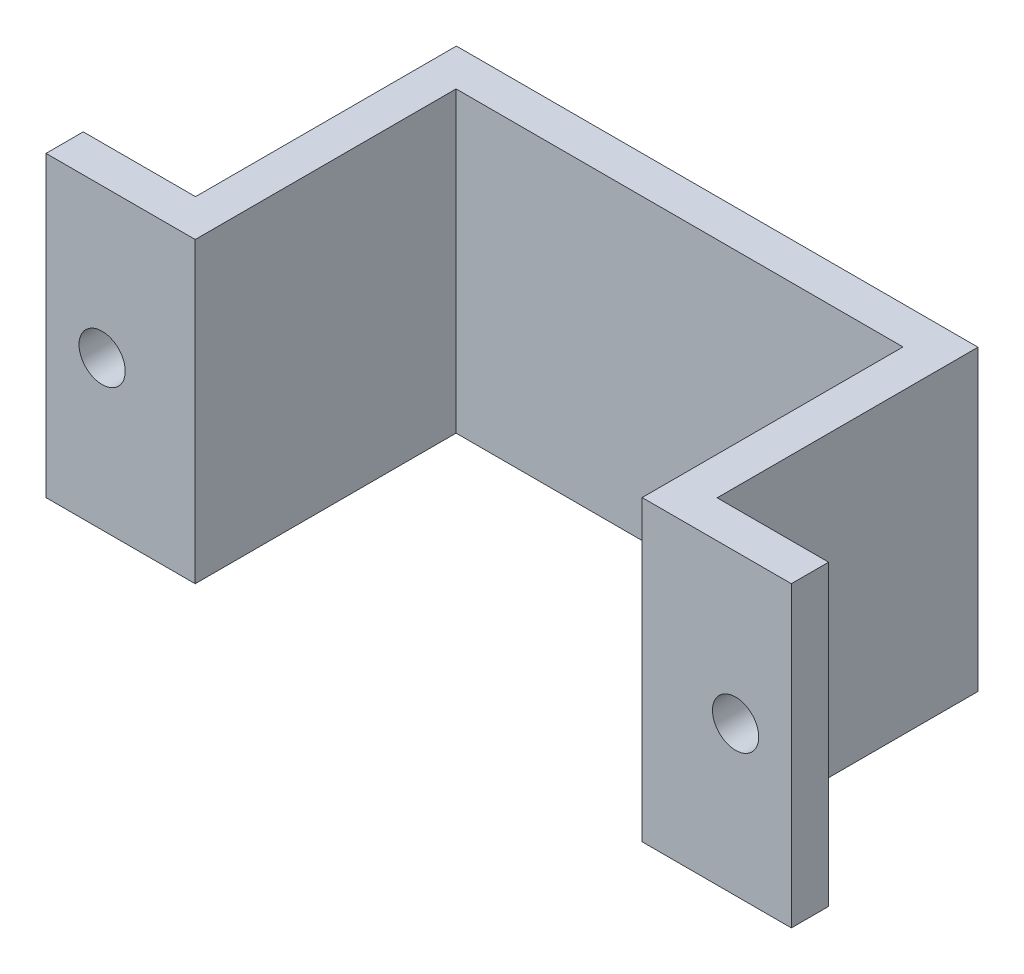
ISO-10303-21;
HEADER;
FILE_DESCRIPTION(('STEP AP214'),'2;1');
FILE_NAME('part.step','',(''),(''),'','','');
FILE_SCHEMA(('AUTOMOTIVE_DESIGN { 1 0 10303 214 1 1 1 1 }'));
ENDSEC;
DATA;
#1=APPLICATION_CONTEXT('core data for automotive mechanical design processes');
#2=APPLICATION_PROTOCOL_DEFINITION('international standard','automotive_design',2000,#1);
#3=PRODUCT_CONTEXT('',#1,'mechanical');
#4=PRODUCT('Part','Part','',(#3));
#5=PRODUCT_RELATED_PRODUCT_CATEGORY('part','',(#4));
#6=PRODUCT_DEFINITION_FORMATION('','',#4);
#7=PRODUCT_DEFINITION_CONTEXT('part definition',#1,'design');
#8=PRODUCT_DEFINITION('design','',#6,#7);
#9=PRODUCT_DEFINITION_SHAPE('','',#8);
#10=(LENGTH_UNIT() NAMED_UNIT(*) SI_UNIT(.MILLI.,.METRE.));
#11=(NAMED_UNIT(*) PLANE_ANGLE_UNIT() SI_UNIT($,.RADIAN.));
#12=(NAMED_UNIT(*) SI_UNIT($,.STERADIAN.) SOLID_ANGLE_UNIT());
#13=UNCERTAINTY_MEASURE_WITH_UNIT(LENGTH_MEASURE(1.E-05),#10,'distance_accuracy_value','');
#14=(GEOMETRIC_REPRESENTATION_CONTEXT(3) GLOBAL_UNCERTAINTY_ASSIGNED_CONTEXT((#13)) GLOBAL_UNIT_ASSIGNED_CONTEXT((#10,
#11,#12)) REPRESENTATION_CONTEXT('',''));
#15=CARTESIAN_POINT('',(0.,0.,0.));
#16=DIRECTION('',(0.,0.,1.));
#17=DIRECTION('',(1.,0.,0.));
#18=AXIS2_PLACEMENT_3D('',#15,#16,#17);
#19=CARTESIAN_POINT('',(0.,0.,50.8));
#20=DIRECTION('',(0.,0.,1.));
#21=DIRECTION('',(1.,0.,0.));
#22=AXIS2_PLACEMENT_3D('',#19,#20,#21);
#23=PLANE('',#22);
#24=CARTESIAN_POINT('',(-53.9362964315127,0.,50.8));
#25=DIRECTION('',(0.,0.,1.));
#26=DIRECTION('',(1.,0.,0.));
#27=AXIS2_PLACEMENT_3D('',#24,#25,#26);
#28=CIRCLE('',#27,3.93699999999999);
#29=CARTESIAN_POINT('',(-49.9992964315127,0.,50.8));
#30=VERTEX_POINT('',#29);
#31=EDGE_CURVE('E362',#30,#30,#28,.T.);
#32=ORIENTED_EDGE('',*,*,#31,.F.);
#33=EDGE_LOOP('',(#32));
#34=FACE_BOUND('',#33,.T.);
#35=DIRECTION('',(0.,-1.,0.));
#36=VECTOR('',#35,1.);
#37=CARTESIAN_POINT('',(-38.0756670221007,-25.4,50.8));
#38=LINE('',#37,#36);
#39=CARTESIAN_POINT('',(-38.0756670221007,25.4,50.8));
#40=VERTEX_POINT('',#39);
#41=CARTESIAN_POINT('',(-38.0756670221007,-25.4,50.8));
#42=VERTEX_POINT('',#41);
#43=EDGE_CURVE('E154',#40,#42,#38,.T.);
#44=ORIENTED_EDGE('',*,*,#43,.F.);
#45=DIRECTION('',(-1.,0.,0.));
#46=VECTOR('',#45,1.);
#47=CARTESIAN_POINT('',(63.5,25.4,50.8));
#48=LINE('',#47,#46);
#49=CARTESIAN_POINT('',(-63.5,25.4,50.8));
#50=VERTEX_POINT('',#49);
#51=EDGE_CURVE('E257',#40,#50,#48,.T.);
#52=ORIENTED_EDGE('',*,*,#51,.T.);
#53=DIRECTION('',(0.,-1.,0.));
#54=VECTOR('',#53,1.);
#55=CARTESIAN_POINT('',(-63.5,-25.4,50.8));
#56=LINE('',#55,#54);
#57=CARTESIAN_POINT('',(-63.5,-25.4,50.8));
#58=VERTEX_POINT('',#57);
#59=EDGE_CURVE('E245',#50,#58,#56,.T.);
#60=ORIENTED_EDGE('',*,*,#59,.T.);
#61=DIRECTION('',(1.,0.,0.));
#62=VECTOR('',#61,1.);
#63=CARTESIAN_POINT('',(63.5,-25.4,50.8));
#64=LINE('',#63,#62);
#65=EDGE_CURVE('E251',#58,#42,#64,.T.);
#66=ORIENTED_EDGE('',*,*,#65,.T.);
#67=EDGE_LOOP('',(#44,#52,#60,#66));
#68=FACE_BOUND('',#67,.T.);
#69=ADVANCED_FACE('F59',(#34,#68),#23,.T.);
#70=CARTESIAN_POINT('',(-63.5,-25.4,50.8));
#71=DIRECTION('',(1.,0.,0.));
#72=DIRECTION('',(0.,0.,-1.));
#73=AXIS2_PLACEMENT_3D('',#70,#71,#72);
#74=PLANE('',#73);
#75=DIRECTION('',(0.,1.,0.));
#76=VECTOR('',#75,1.);
#77=CARTESIAN_POINT('',(-63.5,-25.4,44.45));
#78=LINE('',#77,#76);
#79=CARTESIAN_POINT('',(-63.5,-25.4,44.45));
#80=VERTEX_POINT('',#79);
#81=CARTESIAN_POINT('',(-63.5,25.4,44.45));
#82=VERTEX_POINT('',#81);
#83=EDGE_CURVE('E232',#80,#82,#78,.T.);
#84=ORIENTED_EDGE('',*,*,#83,.F.);
#85=DIRECTION('',(0.,0.,-1.));
#86=VECTOR('',#85,1.);
#87=CARTESIAN_POINT('',(-63.5,-25.4,50.8));
#88=LINE('',#87,#86);
#89=EDGE_CURVE('E13',#58,#80,#88,.T.);
#90=ORIENTED_EDGE('',*,*,#89,.F.);
#91=ORIENTED_EDGE('',*,*,#59,.F.);
#92=DIRECTION('',(0.,0.,-1.));
#93=VECTOR('',#92,1.);
#94=CARTESIAN_POINT('',(-63.5,25.4,50.8));
#95=LINE('',#94,#93);
#96=EDGE_CURVE('E262',#50,#82,#95,.T.);
#97=ORIENTED_EDGE('',*,*,#96,.T.);
#98=EDGE_LOOP('',(#84,#90,#91,#97));
#99=FACE_BOUND('',#98,.T.);
#100=ADVANCED_FACE('F61',(#99),#74,.F.);
#101=CARTESIAN_POINT('',(63.5,-25.4,50.8));
#102=DIRECTION('',(0.,1.,0.));
#103=DIRECTION('',(-1.,0.,0.));
#104=AXIS2_PLACEMENT_3D('',#101,#102,#103);
#105=PLANE('',#104);
#106=DIRECTION('',(1.,0.,0.));
#107=VECTOR('',#106,1.);
#108=CARTESIAN_POINT('',(38.0756670221007,-25.4,6.35));
#109=LINE('',#108,#107);
#110=CARTESIAN_POINT('',(-38.0756670221007,-25.4,6.35));
#111=VERTEX_POINT('',#110);
#112=CARTESIAN_POINT('',(38.0756670221007,-25.4,6.35));
#113=VERTEX_POINT('',#112);
#114=EDGE_CURVE('E165',#111,#113,#109,.T.);
#115=ORIENTED_EDGE('',*,*,#114,.F.);
#116=DIRECTION('',(0.,0.,1.));
#117=VECTOR('',#116,1.);
#118=CARTESIAN_POINT('',(-38.0756670221007,-25.4,6.35));
#119=LINE('',#118,#117);
#120=EDGE_CURVE('E148',#111,#42,#119,.T.);
#121=ORIENTED_EDGE('',*,*,#120,.T.);
#122=ORIENTED_EDGE('',*,*,#65,.F.);
#123=ORIENTED_EDGE('',*,*,#89,.T.);
#124=DIRECTION('',(-1.,0.,0.));
#125=VECTOR('',#124,1.);
#126=CARTESIAN_POINT('',(-44.3725928630254,-25.4,44.45));
#127=LINE('',#126,#125);
#128=CARTESIAN_POINT('',(-44.3725928630254,-25.4,44.45));
#129=VERTEX_POINT('',#128);
#130=EDGE_CURVE('E226',#129,#80,#127,.T.);
#131=ORIENTED_EDGE('',*,*,#130,.F.);
#132=DIRECTION('',(0.,0.,-1.));
#133=VECTOR('',#132,1.);
#134=CARTESIAN_POINT('',(-44.3725928630254,-25.4,44.45));
#135=LINE('',#134,#133);
#136=CARTESIAN_POINT('',(-44.3725928630254,-25.4,0.));
#137=VERTEX_POINT('',#136);
#138=EDGE_CURVE('E191',#129,#137,#135,.T.);
#139=ORIENTED_EDGE('',*,*,#138,.T.);
#140=DIRECTION('',(1.,0.,0.));
#141=VECTOR('',#140,1.);
#142=CARTESIAN_POINT('',(63.5,-25.4,0.));
#143=LINE('',#142,#141);
#144=CARTESIAN_POINT('',(44.5038727235669,-25.4,0.));
#145=VERTEX_POINT('',#144);
#146=EDGE_CURVE('E220',#137,#145,#143,.T.);
#147=ORIENTED_EDGE('',*,*,#146,.T.);
#148=DIRECTION('',(0.,0.,-1.));
#149=VECTOR('',#148,1.);
#150=CARTESIAN_POINT('',(44.5038727235669,-25.4,44.45));
#151=LINE('',#150,#149);
#152=CARTESIAN_POINT('',(44.5038727235669,-25.4,44.45));
#153=VERTEX_POINT('',#152);
#154=EDGE_CURVE('E83',#153,#145,#151,.T.);
#155=ORIENTED_EDGE('',*,*,#154,.F.);
#156=DIRECTION('',(-1.,0.,0.));
#157=VECTOR('',#156,1.);
#158=CARTESIAN_POINT('',(44.5038727235669,-25.4,44.45));
#159=LINE('',#158,#157);
#160=CARTESIAN_POINT('',(63.5,-25.4,44.45));
#161=VERTEX_POINT('',#160);
#162=EDGE_CURVE('E201',#161,#153,#159,.T.);
#163=ORIENTED_EDGE('',*,*,#162,.F.);
#164=DIRECTION('',(0.,0.,-1.));
#165=VECTOR('',#164,1.);
#166=CARTESIAN_POINT('',(63.5,-25.4,50.8));
#167=LINE('',#166,#165);
#168=CARTESIAN_POINT('',(63.5,-25.4,50.8));
#169=VERTEX_POINT('',#168);
#170=EDGE_CURVE('E68',#169,#161,#167,.T.);
#171=ORIENTED_EDGE('',*,*,#170,.F.);
#172=CARTESIAN_POINT('',(38.0756670221007,-25.4,50.8));
#173=VERTEX_POINT('',#172);
#174=EDGE_CURVE('E249',#173,#169,#64,.T.);
#175=ORIENTED_EDGE('',*,*,#174,.F.);
#176=DIRECTION('',(0.,0.,1.));
#177=VECTOR('',#176,1.);
#178=CARTESIAN_POINT('',(38.0756670221007,-25.4,6.35));
#179=LINE('',#178,#177);
#180=EDGE_CURVE('E75',#113,#173,#179,.T.);
#181=ORIENTED_EDGE('',*,*,#180,.F.);
#182=EDGE_LOOP('',(#115,#121,#122,#123,#131,#139,#147,#155,#163,#171,#175,#181));
#183=FACE_BOUND('',#182,.T.);
#184=ADVANCED_FACE('F171',(#183),#105,.F.);
#185=CARTESIAN_POINT('',(63.5,-25.4,50.8));
#186=DIRECTION('',(-1.,0.,0.));
#187=DIRECTION('',(0.,0.,1.));
#188=AXIS2_PLACEMENT_3D('',#185,#186,#187);
#189=PLANE('',#188);
#190=ORIENTED_EDGE('',*,*,#170,.T.);
#191=DIRECTION('',(0.,-1.,0.));
#192=VECTOR('',#191,1.);
#193=CARTESIAN_POINT('',(63.5,-25.4,44.45));
#194=LINE('',#193,#192);
#195=CARTESIAN_POINT('',(63.5,25.4,44.45));
#196=VERTEX_POINT('',#195);
#197=EDGE_CURVE('E198',#196,#161,#194,.T.);
#198=ORIENTED_EDGE('',*,*,#197,.F.);
#199=DIRECTION('',(0.,0.,-1.));
#200=VECTOR('',#199,1.);
#201=CARTESIAN_POINT('',(63.5,25.4,50.8));
#202=LINE('',#201,#200);
#203=CARTESIAN_POINT('',(63.5,25.4,50.8));
#204=VERTEX_POINT('',#203);
#205=EDGE_CURVE('E272',#204,#196,#202,.T.);
#206=ORIENTED_EDGE('',*,*,#205,.F.);
#207=DIRECTION('',(0.,1.,0.));
#208=VECTOR('',#207,1.);
#209=CARTESIAN_POINT('',(63.5,-25.4,50.8));
#210=LINE('',#209,#208);
#211=EDGE_CURVE('E254',#169,#204,#210,.T.);
#212=ORIENTED_EDGE('',*,*,#211,.F.);
#213=EDGE_LOOP('',(#190,#198,#206,#212));
#214=FACE_BOUND('',#213,.T.);
#215=ADVANCED_FACE('F282',(#214),#189,.F.);
#216=CARTESIAN_POINT('',(63.5,25.4,50.8));
#217=DIRECTION('',(0.,-1.,0.));
#218=DIRECTION('',(1.,0.,0.));
#219=AXIS2_PLACEMENT_3D('',#216,#217,#218);
#220=PLANE('',#219);
#221=ORIENTED_EDGE('',*,*,#51,.F.);
#222=DIRECTION('',(0.,0.,1.));
#223=VECTOR('',#222,1.);
#224=CARTESIAN_POINT('',(-38.0756670221007,25.4,6.35));
#225=LINE('',#224,#223);
#226=CARTESIAN_POINT('',(-38.0756670221007,25.4,6.35));
#227=VERTEX_POINT('',#226);
#228=EDGE_CURVE('E188',#227,#40,#225,.T.);
#229=ORIENTED_EDGE('',*,*,#228,.F.);
#230=DIRECTION('',(-1.,0.,0.));
#231=VECTOR('',#230,1.);
#232=CARTESIAN_POINT('',(38.0756670221007,25.4,6.35));
#233=LINE('',#232,#231);
#234=CARTESIAN_POINT('',(38.0756670221007,25.4,6.35));
#235=VERTEX_POINT('',#234);
#236=EDGE_CURVE('E159',#235,#227,#233,.T.);
#237=ORIENTED_EDGE('',*,*,#236,.F.);
#238=DIRECTION('',(0.,0.,1.));
#239=VECTOR('',#238,1.);
#240=CARTESIAN_POINT('',(38.0756670221007,25.4,6.35));
#241=LINE('',#240,#239);
#242=CARTESIAN_POINT('',(38.0756670221007,25.4,50.8));
#243=VERTEX_POINT('',#242);
#244=EDGE_CURVE('E192',#235,#243,#241,.T.);
#245=ORIENTED_EDGE('',*,*,#244,.T.);
#246=EDGE_CURVE('E258',#204,#243,#48,.T.);
#247=ORIENTED_EDGE('',*,*,#246,.F.);
#248=ORIENTED_EDGE('',*,*,#205,.T.);
#249=DIRECTION('',(1.,0.,0.));
#250=VECTOR('',#249,1.);
#251=CARTESIAN_POINT('',(63.5,25.4,44.45));
#252=LINE('',#251,#250);
#253=CARTESIAN_POINT('',(44.5038727235669,25.4,44.45));
#254=VERTEX_POINT('',#253);
#255=EDGE_CURVE('E210',#254,#196,#252,.T.);
#256=ORIENTED_EDGE('',*,*,#255,.F.);
#257=DIRECTION('',(0.,0.,-1.));
#258=VECTOR('',#257,1.);
#259=CARTESIAN_POINT('',(44.5038727235669,25.4,44.45));
#260=LINE('',#259,#258);
#261=CARTESIAN_POINT('',(44.5038727235669,25.4,0.));
#262=VERTEX_POINT('',#261);
#263=EDGE_CURVE('E216',#254,#262,#260,.T.);
#264=ORIENTED_EDGE('',*,*,#263,.T.);
#265=DIRECTION('',(-1.,0.,0.));
#266=VECTOR('',#265,1.);
#267=CARTESIAN_POINT('',(63.5,25.4,0.));
#268=LINE('',#267,#266);
#269=CARTESIAN_POINT('',(-44.3725928630254,25.4,0.));
#270=VERTEX_POINT('',#269);
#271=EDGE_CURVE('E250',#262,#270,#268,.T.);
#272=ORIENTED_EDGE('',*,*,#271,.T.);
#273=DIRECTION('',(0.,0.,-1.));
#274=VECTOR('',#273,1.);
#275=CARTESIAN_POINT('',(-44.3725928630254,25.4,44.45));
#276=LINE('',#275,#274);
#277=CARTESIAN_POINT('',(-44.3725928630254,25.4,44.45));
#278=VERTEX_POINT('',#277);
#279=EDGE_CURVE('E223',#278,#270,#276,.T.);
#280=ORIENTED_EDGE('',*,*,#279,.F.);
#281=DIRECTION('',(1.,0.,0.));
#282=VECTOR('',#281,1.);
#283=CARTESIAN_POINT('',(-63.5,25.4,44.45));
#284=LINE('',#283,#282);
#285=EDGE_CURVE('E239',#82,#278,#284,.T.);
#286=ORIENTED_EDGE('',*,*,#285,.F.);
#287=ORIENTED_EDGE('',*,*,#96,.F.);
#288=EDGE_LOOP('',(#221,#229,#237,#245,#247,#248,#256,#264,#272,#280,#286,#287));
#289=FACE_BOUND('',#288,.T.);
#290=ADVANCED_FACE('F290',(#289),#220,.F.);
#291=CARTESIAN_POINT('',(54.0019363617835,0.,50.8));
#292=DIRECTION('',(0.,0.,1.));
#293=DIRECTION('',(1.,0.,0.));
#294=AXIS2_PLACEMENT_3D('',#291,#292,#293);
#295=CIRCLE('',#294,3.937);
#296=CARTESIAN_POINT('',(57.9389363617835,0.,50.8));
#297=VERTEX_POINT('',#296);
#298=EDGE_CURVE('E185',#297,#297,#295,.T.);
#299=ORIENTED_EDGE('',*,*,#298,.F.);
#300=EDGE_LOOP('',(#299));
#301=FACE_BOUND('',#300,.T.);
#302=DIRECTION('',(0.,1.,0.));
#303=VECTOR('',#302,1.);
#304=CARTESIAN_POINT('',(38.0756670221007,-25.4,50.8));
#305=LINE('',#304,#303);
#306=EDGE_CURVE('E169',#173,#243,#305,.T.);
#307=ORIENTED_EDGE('',*,*,#306,.F.);
#308=ORIENTED_EDGE('',*,*,#174,.T.);
#309=ORIENTED_EDGE('',*,*,#211,.T.);
#310=ORIENTED_EDGE('',*,*,#246,.T.);
#311=EDGE_LOOP('',(#307,#308,#309,#310));
#312=FACE_BOUND('',#311,.T.);
#313=ADVANCED_FACE('F294',(#301,#312),#23,.T.);
#314=CARTESIAN_POINT('',(0.,0.,0.));
#315=DIRECTION('',(0.,0.,1.));
#316=DIRECTION('',(1.,0.,0.));
#317=AXIS2_PLACEMENT_3D('',#314,#315,#316);
#318=PLANE('',#317);
#319=ORIENTED_EDGE('',*,*,#271,.F.);
#320=DIRECTION('',(0.,1.,0.));
#321=VECTOR('',#320,1.);
#322=CARTESIAN_POINT('',(44.5038727235669,25.4,0.));
#323=LINE('',#322,#321);
#324=EDGE_CURVE('E202',#145,#262,#323,.T.);
#325=ORIENTED_EDGE('',*,*,#324,.F.);
#326=ORIENTED_EDGE('',*,*,#146,.F.);
#327=DIRECTION('',(0.,-1.,0.));
#328=VECTOR('',#327,1.);
#329=CARTESIAN_POINT('',(-44.3725928630254,25.4,0.));
#330=LINE('',#329,#328);
#331=EDGE_CURVE('E215',#270,#137,#330,.T.);
#332=ORIENTED_EDGE('',*,*,#331,.F.);
#333=EDGE_LOOP('',(#319,#325,#326,#332));
#334=FACE_BOUND('',#333,.T.);
#335=ADVANCED_FACE('F412',(#334),#318,.F.);
#336=CARTESIAN_POINT('',(-44.3725928630254,25.4,44.45));
#337=DIRECTION('',(1.,0.,0.));
#338=DIRECTION('',(0.,0.,-1.));
#339=AXIS2_PLACEMENT_3D('',#336,#337,#338);
#340=PLANE('',#339);
#341=ORIENTED_EDGE('',*,*,#331,.T.);
#342=ORIENTED_EDGE('',*,*,#138,.F.);
#343=DIRECTION('',(0.,-1.,0.));
#344=VECTOR('',#343,1.);
#345=CARTESIAN_POINT('',(-44.3725928630254,25.4,44.45));
#346=LINE('',#345,#344);
#347=EDGE_CURVE('E235',#278,#129,#346,.T.);
#348=ORIENTED_EDGE('',*,*,#347,.F.);
#349=ORIENTED_EDGE('',*,*,#279,.T.);
#350=EDGE_LOOP('',(#341,#342,#348,#349));
#351=FACE_BOUND('',#350,.T.);
#352=ADVANCED_FACE('F382',(#351),#340,.F.);
#353=CARTESIAN_POINT('',(0.,0.,44.45));
#354=DIRECTION('',(0.,0.,-1.));
#355=DIRECTION('',(-1.,0.,0.));
#356=AXIS2_PLACEMENT_3D('',#353,#354,#355);
#357=PLANE('',#356);
#358=CARTESIAN_POINT('',(-53.9362964315127,0.,44.45));
#359=DIRECTION('',(0.,0.,-1.));
#360=DIRECTION('',(-1.,0.,0.));
#361=AXIS2_PLACEMENT_3D('',#358,#359,#360);
#362=CIRCLE('',#361,3.93699999999999);
#363=CARTESIAN_POINT('',(-57.8732964315127,0.,44.45));
#364=VERTEX_POINT('',#363);
#365=EDGE_CURVE('E368',#364,#364,#362,.T.);
#366=ORIENTED_EDGE('',*,*,#365,.F.);
#367=EDGE_LOOP('',(#366));
#368=FACE_BOUND('',#367,.T.);
#369=ORIENTED_EDGE('',*,*,#83,.T.);
#370=ORIENTED_EDGE('',*,*,#285,.T.);
#371=ORIENTED_EDGE('',*,*,#347,.T.);
#372=ORIENTED_EDGE('',*,*,#130,.T.);
#373=EDGE_LOOP('',(#369,#370,#371,#372));
#374=FACE_BOUND('',#373,.T.);
#375=ADVANCED_FACE('F378',(#368,#374),#357,.T.);
#376=CARTESIAN_POINT('',(44.5038727235669,25.4,44.45));
#377=DIRECTION('',(-1.,0.,0.));
#378=DIRECTION('',(0.,0.,1.));
#379=AXIS2_PLACEMENT_3D('',#376,#377,#378);
#380=PLANE('',#379);
#381=ORIENTED_EDGE('',*,*,#324,.T.);
#382=ORIENTED_EDGE('',*,*,#263,.F.);
#383=DIRECTION('',(0.,1.,0.));
#384=VECTOR('',#383,1.);
#385=CARTESIAN_POINT('',(44.5038727235669,25.4,44.45));
#386=LINE('',#385,#384);
#387=EDGE_CURVE('E206',#153,#254,#386,.T.);
#388=ORIENTED_EDGE('',*,*,#387,.F.);
#389=ORIENTED_EDGE('',*,*,#154,.T.);
#390=EDGE_LOOP('',(#381,#382,#388,#389));
#391=FACE_BOUND('',#390,.T.);
#392=ADVANCED_FACE('F381',(#391),#380,.F.);
#393=CARTESIAN_POINT('',(0.,0.,44.45));
#394=DIRECTION('',(0.,0.,1.));
#395=DIRECTION('',(1.,0.,0.));
#396=AXIS2_PLACEMENT_3D('',#393,#394,#395);
#397=PLANE('',#396);
#398=CARTESIAN_POINT('',(54.0019363617835,0.,44.45));
#399=DIRECTION('',(0.,0.,-1.));
#400=DIRECTION('',(-1.,0.,0.));
#401=AXIS2_PLACEMENT_3D('',#398,#399,#400);
#402=CIRCLE('',#401,3.937);
#403=CARTESIAN_POINT('',(50.0649363617835,0.,44.45));
#404=VERTEX_POINT('',#403);
#405=EDGE_CURVE('E357',#404,#404,#402,.T.);
#406=ORIENTED_EDGE('',*,*,#405,.F.);
#407=EDGE_LOOP('',(#406));
#408=FACE_BOUND('',#407,.T.);
#409=ORIENTED_EDGE('',*,*,#197,.T.);
#410=ORIENTED_EDGE('',*,*,#162,.T.);
#411=ORIENTED_EDGE('',*,*,#387,.T.);
#412=ORIENTED_EDGE('',*,*,#255,.T.);
#413=EDGE_LOOP('',(#409,#410,#411,#412));
#414=FACE_BOUND('',#413,.T.);
#415=ADVANCED_FACE('F286',(#408,#414),#397,.F.);
#416=CARTESIAN_POINT('',(-38.0756670221007,-25.4,6.35));
#417=DIRECTION('',(-1.,0.,0.));
#418=DIRECTION('',(0.,0.,1.));
#419=AXIS2_PLACEMENT_3D('',#416,#417,#418);
#420=PLANE('',#419);
#421=ORIENTED_EDGE('',*,*,#43,.T.);
#422=ORIENTED_EDGE('',*,*,#120,.F.);
#423=DIRECTION('',(0.,-1.,0.));
#424=VECTOR('',#423,1.);
#425=CARTESIAN_POINT('',(-38.0756670221007,-25.4,6.35));
#426=LINE('',#425,#424);
#427=EDGE_CURVE('E151',#227,#111,#426,.T.);
#428=ORIENTED_EDGE('',*,*,#427,.F.);
#429=ORIENTED_EDGE('',*,*,#228,.T.);
#430=EDGE_LOOP('',(#421,#422,#428,#429));
#431=FACE_BOUND('',#430,.T.);
#432=ADVANCED_FACE('F150',(#431),#420,.F.);
#433=CARTESIAN_POINT('',(38.0756670221007,-25.4,6.35));
#434=DIRECTION('',(1.,0.,0.));
#435=DIRECTION('',(0.,0.,-1.));
#436=AXIS2_PLACEMENT_3D('',#433,#434,#435);
#437=PLANE('',#436);
#438=ORIENTED_EDGE('',*,*,#306,.T.);
#439=ORIENTED_EDGE('',*,*,#244,.F.);
#440=DIRECTION('',(0.,1.,0.));
#441=VECTOR('',#440,1.);
#442=CARTESIAN_POINT('',(38.0756670221007,-25.4,6.35));
#443=LINE('',#442,#441);
#444=EDGE_CURVE('E174',#113,#235,#443,.T.);
#445=ORIENTED_EDGE('',*,*,#444,.F.);
#446=ORIENTED_EDGE('',*,*,#180,.T.);
#447=EDGE_LOOP('',(#438,#439,#445,#446));
#448=FACE_BOUND('',#447,.T.);
#449=ADVANCED_FACE('F451',(#448),#437,.F.);
#450=CARTESIAN_POINT('',(0.,0.,6.35));
#451=DIRECTION('',(0.,0.,1.));
#452=DIRECTION('',(1.,0.,0.));
#453=AXIS2_PLACEMENT_3D('',#450,#451,#452);
#454=PLANE('',#453);
#455=ORIENTED_EDGE('',*,*,#427,.T.);
#456=ORIENTED_EDGE('',*,*,#114,.T.);
#457=ORIENTED_EDGE('',*,*,#444,.T.);
#458=ORIENTED_EDGE('',*,*,#236,.T.);
#459=EDGE_LOOP('',(#455,#456,#457,#458));
#460=FACE_BOUND('',#459,.T.);
#461=ADVANCED_FACE('F163',(#460),#454,.T.);
#462=CARTESIAN_POINT('',(54.0019363617835,0.,88.9));
#463=DIRECTION('',(0.,0.,-1.));
#464=DIRECTION('',(-1.,0.,0.));
#465=AXIS2_PLACEMENT_3D('',#462,#463,#464);
#466=CYLINDRICAL_SURFACE('',#465,3.937);
#467=ORIENTED_EDGE('',*,*,#298,.T.);
#468=EDGE_LOOP('',(#467));
#469=FACE_BOUND('',#468,.T.);
#470=ORIENTED_EDGE('',*,*,#405,.T.);
#471=EDGE_LOOP('',(#470));
#472=FACE_BOUND('',#471,.T.);
#473=ADVANCED_FACE('F442',(#469,#472),#466,.F.);
#474=CARTESIAN_POINT('',(-53.9362964315127,0.,88.9));
#475=DIRECTION('',(0.,0.,-1.));
#476=DIRECTION('',(-1.,0.,0.));
#477=AXIS2_PLACEMENT_3D('',#474,#475,#476);
#478=CYLINDRICAL_SURFACE('',#477,3.93699999999999);
#479=ORIENTED_EDGE('',*,*,#31,.T.);
#480=EDGE_LOOP('',(#479));
#481=FACE_BOUND('',#480,.T.);
#482=ORIENTED_EDGE('',*,*,#365,.T.);
#483=EDGE_LOOP('',(#482));
#484=FACE_BOUND('',#483,.T.);
#485=ADVANCED_FACE('F376',(#481,#484),#478,.F.);
#486=CLOSED_SHELL('',(#69,#100,#184,#215,#290,#313,#335,#352,#375,#392,#415,#432,#449,#461,#473,#485));
#487=MANIFOLD_SOLID_BREP('B2',#486);
#488=ADVANCED_BREP_SHAPE_REPRESENTATION('',(#18,#487),#14);
#489=SHAPE_DEFINITION_REPRESENTATION(#9,#488);
ENDSEC;
END-ISO-10303-21;
